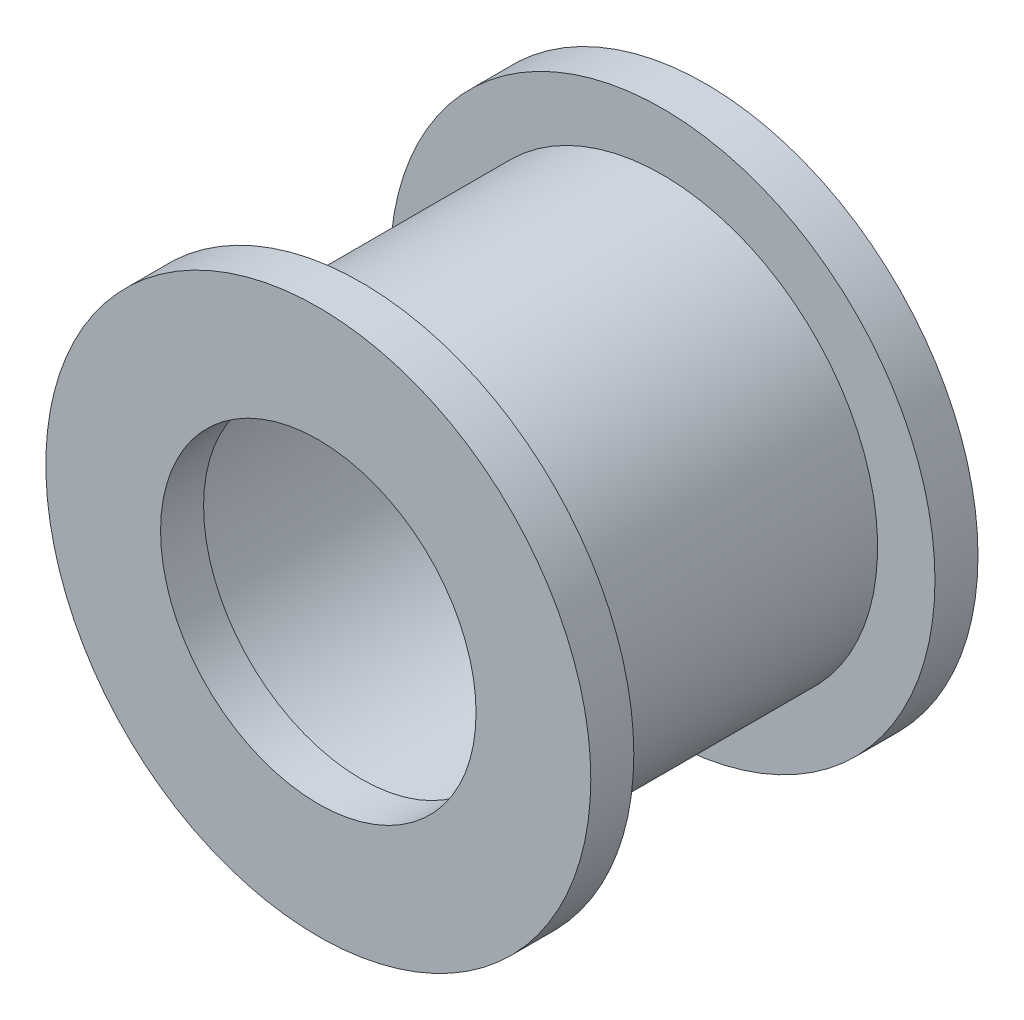
ISO-10303-21;
HEADER;
FILE_DESCRIPTION(('STEP AP214'),'2;1');
FILE_NAME('part.step','',(''),(''),'','','');
FILE_SCHEMA(('AUTOMOTIVE_DESIGN { 1 0 10303 214 1 1 1 1 }'));
ENDSEC;
DATA;
#1=APPLICATION_CONTEXT('core data for automotive mechanical design processes');
#2=APPLICATION_PROTOCOL_DEFINITION('international standard','automotive_design',2000,#1);
#3=PRODUCT_CONTEXT('',#1,'mechanical');
#4=PRODUCT('Part','Part','',(#3));
#5=PRODUCT_RELATED_PRODUCT_CATEGORY('part','',(#4));
#6=PRODUCT_DEFINITION_FORMATION('','',#4);
#7=PRODUCT_DEFINITION_CONTEXT('part definition',#1,'design');
#8=PRODUCT_DEFINITION('design','',#6,#7);
#9=PRODUCT_DEFINITION_SHAPE('','',#8);
#10=(LENGTH_UNIT() NAMED_UNIT(*) SI_UNIT(.MILLI.,.METRE.));
#11=(NAMED_UNIT(*) PLANE_ANGLE_UNIT() SI_UNIT($,.RADIAN.));
#12=(NAMED_UNIT(*) SI_UNIT($,.STERADIAN.) SOLID_ANGLE_UNIT());
#13=UNCERTAINTY_MEASURE_WITH_UNIT(LENGTH_MEASURE(1.E-05),#10,'distance_accuracy_value','');
#14=(GEOMETRIC_REPRESENTATION_CONTEXT(3) GLOBAL_UNCERTAINTY_ASSIGNED_CONTEXT((#13)) GLOBAL_UNIT_ASSIGNED_CONTEXT((#10,
#11,#12)) REPRESENTATION_CONTEXT('',''));
#15=CARTESIAN_POINT('',(0.,0.,0.));
#16=DIRECTION('',(0.,0.,1.));
#17=DIRECTION('',(1.,0.,0.));
#18=AXIS2_PLACEMENT_3D('',#15,#16,#17);
#19=CARTESIAN_POINT('',(0.,0.,1.5));
#20=DIRECTION('',(0.,0.,1.));
#21=DIRECTION('',(1.,0.,0.));
#22=AXIS2_PLACEMENT_3D('',#19,#20,#21);
#23=PLANE('',#22);
#24=CARTESIAN_POINT('',(0.,0.,1.5));
#25=DIRECTION('',(0.,0.,1.));
#26=DIRECTION('',(1.,0.,0.));
#27=AXIS2_PLACEMENT_3D('',#24,#25,#26);
#28=CIRCLE('',#27,5.5);
#29=CARTESIAN_POINT('',(5.5,0.,1.5));
#30=VERTEX_POINT('',#29);
#31=EDGE_CURVE('E47',#30,#30,#28,.T.);
#32=ORIENTED_EDGE('',*,*,#31,.F.);
#33=EDGE_LOOP('',(#32));
#34=FACE_BOUND('',#33,.T.);
#35=CARTESIAN_POINT('',(0.,0.,1.5));
#36=DIRECTION('',(0.,0.,1.));
#37=DIRECTION('',(1.,0.,0.));
#38=AXIS2_PLACEMENT_3D('',#35,#36,#37);
#39=CIRCLE('',#38,6.5);
#40=CARTESIAN_POINT('',(-6.5,0.,1.5));
#41=VERTEX_POINT('',#40);
#42=EDGE_CURVE('E10',#41,#41,#39,.F.);
#43=ORIENTED_EDGE('',*,*,#42,.F.);
#44=EDGE_LOOP('',(#43));
#45=FACE_BOUND('',#44,.T.);
#46=ADVANCED_FACE('F36',(#34,#45),#23,.T.);
#47=CARTESIAN_POINT('',(0.,0.,1.5));
#48=DIRECTION('',(0.,0.,-1.));
#49=DIRECTION('',(-1.,0.,0.));
#50=AXIS2_PLACEMENT_3D('',#47,#48,#49);
#51=CYLINDRICAL_SURFACE('',#50,5.5);
#52=ORIENTED_EDGE('',*,*,#31,.T.);
#53=EDGE_LOOP('',(#52));
#54=FACE_BOUND('',#53,.T.);
#55=CARTESIAN_POINT('',(0.,0.,0.));
#56=DIRECTION('',(0.,0.,1.));
#57=DIRECTION('',(1.,0.,0.));
#58=AXIS2_PLACEMENT_3D('',#55,#56,#57);
#59=CIRCLE('',#58,5.5);
#60=CARTESIAN_POINT('',(5.5,0.,0.));
#61=VERTEX_POINT('',#60);
#62=EDGE_CURVE('E56',#61,#61,#59,.T.);
#63=ORIENTED_EDGE('',*,*,#62,.F.);
#64=EDGE_LOOP('',(#63));
#65=FACE_BOUND('',#64,.T.);
#66=ADVANCED_FACE('F38',(#54,#65),#51,.F.);
#67=CARTESIAN_POINT('',(0.,0.,1.5));
#68=DIRECTION('',(0.,0.,-1.));
#69=DIRECTION('',(-1.,0.,0.));
#70=AXIS2_PLACEMENT_3D('',#67,#68,#69);
#71=CYLINDRICAL_SURFACE('',#70,9.49999999999999);
#72=CARTESIAN_POINT('',(0.,0.,1.5));
#73=DIRECTION('',(0.,0.,1.));
#74=DIRECTION('',(1.,0.,0.));
#75=AXIS2_PLACEMENT_3D('',#72,#73,#74);
#76=CIRCLE('',#75,9.49999999999999);
#77=CARTESIAN_POINT('',(9.49999999999999,0.,1.5));
#78=VERTEX_POINT('',#77);
#79=EDGE_CURVE('E43',#78,#78,#76,.T.);
#80=ORIENTED_EDGE('',*,*,#79,.F.);
#81=EDGE_LOOP('',(#80));
#82=FACE_BOUND('',#81,.T.);
#83=CARTESIAN_POINT('',(0.,0.,0.));
#84=DIRECTION('',(0.,0.,1.));
#85=DIRECTION('',(1.,0.,0.));
#86=AXIS2_PLACEMENT_3D('',#83,#84,#85);
#87=CIRCLE('',#86,9.49999999999999);
#88=CARTESIAN_POINT('',(9.49999999999999,0.,0.));
#89=VERTEX_POINT('',#88);
#90=EDGE_CURVE('E52',#89,#89,#87,.T.);
#91=ORIENTED_EDGE('',*,*,#90,.T.);
#92=EDGE_LOOP('',(#91));
#93=FACE_BOUND('',#92,.T.);
#94=ADVANCED_FACE('F62',(#82,#93),#71,.T.);
#95=CARTESIAN_POINT('',(0.,0.,1.5));
#96=DIRECTION('',(0.,0.,1.));
#97=DIRECTION('',(1.,0.,0.));
#98=AXIS2_PLACEMENT_3D('',#95,#96,#97);
#99=CIRCLE('',#98,7.5);
#100=CARTESIAN_POINT('',(-7.5,0.,1.5));
#101=VERTEX_POINT('',#100);
#102=EDGE_CURVE('E92',#101,#101,#99,.T.);
#103=ORIENTED_EDGE('',*,*,#102,.F.);
#104=EDGE_LOOP('',(#103));
#105=FACE_BOUND('',#104,.T.);
#106=ORIENTED_EDGE('',*,*,#79,.T.);
#107=EDGE_LOOP('',(#106));
#108=FACE_BOUND('',#107,.T.);
#109=ADVANCED_FACE('F68',(#105,#108),#23,.T.);
#110=CARTESIAN_POINT('',(0.,0.,0.));
#111=DIRECTION('',(0.,0.,1.));
#112=DIRECTION('',(1.,0.,0.));
#113=AXIS2_PLACEMENT_3D('',#110,#111,#112);
#114=PLANE('',#113);
#115=ORIENTED_EDGE('',*,*,#90,.F.);
#116=EDGE_LOOP('',(#115));
#117=FACE_BOUND('',#116,.T.);
#118=ORIENTED_EDGE('',*,*,#62,.T.);
#119=EDGE_LOOP('',(#118));
#120=FACE_BOUND('',#119,.T.);
#121=ADVANCED_FACE('F64',(#117,#120),#114,.F.);
#122=CARTESIAN_POINT('',(0.,0.,12.));
#123=DIRECTION('',(0.,0.,-1.));
#124=DIRECTION('',(-1.,0.,0.));
#125=AXIS2_PLACEMENT_3D('',#122,#123,#124);
#126=CYLINDRICAL_SURFACE('',#125,6.5);
#127=CARTESIAN_POINT('',(0.,0.,12.));
#128=DIRECTION('',(0.,0.,1.));
#129=DIRECTION('',(1.,0.,0.));
#130=AXIS2_PLACEMENT_3D('',#127,#128,#129);
#131=CIRCLE('',#130,6.5);
#132=CARTESIAN_POINT('',(-6.5,0.,12.));
#133=VERTEX_POINT('',#132);
#134=EDGE_CURVE('E94',#133,#133,#131,.T.);
#135=CARTESIAN_POINT('',(-6.5,0.,12.));
#136=CARTESIAN_POINT('',(-6.5,0.,11.890625));
#137=CARTESIAN_POINT('',(-6.5,0.,11.78125));
#138=CARTESIAN_POINT('',(-6.5,0.,11.5625));
#139=CARTESIAN_POINT('',(-6.5,0.,11.453125));
#140=CARTESIAN_POINT('',(-6.5,0.,11.234375));
#141=CARTESIAN_POINT('',(-6.5,0.,11.125));
#142=CARTESIAN_POINT('',(-6.5,0.,10.90625));
#143=CARTESIAN_POINT('',(-6.5,0.,10.796875));
#144=CARTESIAN_POINT('',(-6.5,0.,10.578125));
#145=CARTESIAN_POINT('',(-6.5,0.,10.46875));
#146=CARTESIAN_POINT('',(-6.5,0.,10.25));
#147=CARTESIAN_POINT('',(-6.5,0.,10.140625));
#148=CARTESIAN_POINT('',(-6.5,0.,9.921875));
#149=CARTESIAN_POINT('',(-6.5,0.,9.8125));
#150=CARTESIAN_POINT('',(-6.5,0.,9.59375));
#151=CARTESIAN_POINT('',(-6.5,0.,9.484375));
#152=CARTESIAN_POINT('',(-6.5,0.,9.265625));
#153=CARTESIAN_POINT('',(-6.5,0.,9.15625));
#154=CARTESIAN_POINT('',(-6.5,0.,8.9375));
#155=CARTESIAN_POINT('',(-6.5,0.,8.828125));
#156=CARTESIAN_POINT('',(-6.5,0.,8.609375));
#157=CARTESIAN_POINT('',(-6.5,0.,8.5));
#158=CARTESIAN_POINT('',(-6.5,0.,8.28125));
#159=CARTESIAN_POINT('',(-6.5,0.,8.171875));
#160=CARTESIAN_POINT('',(-6.5,0.,7.953125));
#161=CARTESIAN_POINT('',(-6.5,0.,7.84375));
#162=CARTESIAN_POINT('',(-6.5,0.,7.625));
#163=CARTESIAN_POINT('',(-6.5,0.,7.515625));
#164=CARTESIAN_POINT('',(-6.5,0.,7.296875));
#165=CARTESIAN_POINT('',(-6.5,0.,7.1875));
#166=CARTESIAN_POINT('',(-6.5,0.,6.96875));
#167=CARTESIAN_POINT('',(-6.5,0.,6.859375));
#168=CARTESIAN_POINT('',(-6.5,0.,6.640625));
#169=CARTESIAN_POINT('',(-6.5,0.,6.53125));
#170=CARTESIAN_POINT('',(-6.5,0.,6.3125));
#171=CARTESIAN_POINT('',(-6.5,0.,6.203125));
#172=CARTESIAN_POINT('',(-6.5,0.,5.984375));
#173=CARTESIAN_POINT('',(-6.5,0.,5.875));
#174=CARTESIAN_POINT('',(-6.5,0.,5.65625));
#175=CARTESIAN_POINT('',(-6.5,0.,5.546875));
#176=CARTESIAN_POINT('',(-6.5,0.,5.328125));
#177=CARTESIAN_POINT('',(-6.5,0.,5.21875));
#178=CARTESIAN_POINT('',(-6.5,0.,5.));
#179=CARTESIAN_POINT('',(-6.5,0.,4.890625));
#180=CARTESIAN_POINT('',(-6.5,0.,4.671875));
#181=CARTESIAN_POINT('',(-6.5,0.,4.5625));
#182=CARTESIAN_POINT('',(-6.5,0.,4.34375));
#183=CARTESIAN_POINT('',(-6.5,0.,4.234375));
#184=CARTESIAN_POINT('',(-6.5,0.,4.015625));
#185=CARTESIAN_POINT('',(-6.5,0.,3.90625));
#186=CARTESIAN_POINT('',(-6.5,0.,3.6875));
#187=CARTESIAN_POINT('',(-6.5,0.,3.578125));
#188=CARTESIAN_POINT('',(-6.5,0.,3.359375));
#189=CARTESIAN_POINT('',(-6.5,0.,3.25));
#190=CARTESIAN_POINT('',(-6.5,0.,3.03125));
#191=CARTESIAN_POINT('',(-6.5,0.,2.921875));
#192=CARTESIAN_POINT('',(-6.5,0.,2.703125));
#193=CARTESIAN_POINT('',(-6.5,0.,2.59375));
#194=CARTESIAN_POINT('',(-6.5,0.,2.375));
#195=CARTESIAN_POINT('',(-6.5,0.,2.265625));
#196=CARTESIAN_POINT('',(-6.5,0.,2.046875));
#197=CARTESIAN_POINT('',(-6.5,0.,1.9375));
#198=CARTESIAN_POINT('',(-6.5,0.,1.71875));
#199=CARTESIAN_POINT('',(-6.5,0.,1.609375));
#200=CARTESIAN_POINT('',(-6.5,0.,1.5));
#201=B_SPLINE_CURVE_WITH_KNOTS('',3,(#135,#136,#137,#138,#139,#140,#141,#142,#143,#144,#145,
#146,#147,#148,#149,#150,#151,#152,#153,#154,#155,#156,#157,#158,#159,#160,#161,#162,#163,#164,
#165,#166,#167,#168,#169,#170,#171,#172,#173,#174,#175,#176,#177,#178,#179,#180,#181,#182,#183,
#184,#185,#186,#187,#188,#189,#190,#191,#192,#193,#194,#195,#196,#197,#198,#199,#200),
.UNSPECIFIED.,.F.,.F.,(4,2,2,2,2,2,2,2,2,2,2,2,2,2,2,2,2,2,2,2,2,2,2,2,2,2,2,2,2,2,2,2,4),(0.,
0.328125,0.656250000000001,0.984375000000001,1.3125,1.640625,1.96875,2.296875,2.625,2.953125,
3.28125,3.609375,3.9375,4.265625,4.59375,4.921875,5.25,5.578125,5.90625,6.234375,6.5625,
6.890625,7.21875,7.546875,7.875,8.203125,8.53125,8.859375,9.1875,9.515625,9.84375,10.171875,
10.5),.UNSPECIFIED.);
#202=EDGE_CURVE('BSEAM67',#133,#41,#201,.T.);
#203=ORIENTED_EDGE('',*,*,#134,.T.);
#204=ORIENTED_EDGE('',*,*,#42,.T.);
#205=ORIENTED_EDGE('',*,*,#202,.T.);
#206=ORIENTED_EDGE('',*,*,#202,.F.);
#207=EDGE_LOOP('',(#203,#205,#204,#206));
#208=FACE_BOUND('',#207,.T.);
#209=ADVANCED_FACE('F67',(#208),#126,.F.);
#210=CARTESIAN_POINT('',(0.,0.,12.));
#211=DIRECTION('',(0.,0.,-1.));
#212=DIRECTION('',(-1.,0.,0.));
#213=AXIS2_PLACEMENT_3D('',#210,#211,#212);
#214=CYLINDRICAL_SURFACE('',#213,7.5);
#215=CARTESIAN_POINT('',(0.,0.,12.));
#216=DIRECTION('',(0.,0.,1.));
#217=DIRECTION('',(1.,0.,0.));
#218=AXIS2_PLACEMENT_3D('',#215,#216,#217);
#219=CIRCLE('',#218,7.5);
#220=CARTESIAN_POINT('',(-7.5,0.,12.));
#221=VERTEX_POINT('',#220);
#222=EDGE_CURVE('E58',#221,#221,#219,.T.);
#223=CARTESIAN_POINT('',(-7.5,0.,12.));
#224=CARTESIAN_POINT('',(-7.5,0.,11.890625));
#225=CARTESIAN_POINT('',(-7.5,0.,11.78125));
#226=CARTESIAN_POINT('',(-7.5,0.,11.5625));
#227=CARTESIAN_POINT('',(-7.5,0.,11.453125));
#228=CARTESIAN_POINT('',(-7.5,0.,11.234375));
#229=CARTESIAN_POINT('',(-7.5,0.,11.125));
#230=CARTESIAN_POINT('',(-7.5,0.,10.90625));
#231=CARTESIAN_POINT('',(-7.5,0.,10.796875));
#232=CARTESIAN_POINT('',(-7.5,0.,10.578125));
#233=CARTESIAN_POINT('',(-7.5,0.,10.46875));
#234=CARTESIAN_POINT('',(-7.5,0.,10.25));
#235=CARTESIAN_POINT('',(-7.5,0.,10.140625));
#236=CARTESIAN_POINT('',(-7.5,0.,9.921875));
#237=CARTESIAN_POINT('',(-7.5,0.,9.8125));
#238=CARTESIAN_POINT('',(-7.5,0.,9.59375));
#239=CARTESIAN_POINT('',(-7.5,0.,9.484375));
#240=CARTESIAN_POINT('',(-7.5,0.,9.265625));
#241=CARTESIAN_POINT('',(-7.5,0.,9.15625));
#242=CARTESIAN_POINT('',(-7.5,0.,8.9375));
#243=CARTESIAN_POINT('',(-7.5,0.,8.828125));
#244=CARTESIAN_POINT('',(-7.5,0.,8.609375));
#245=CARTESIAN_POINT('',(-7.5,0.,8.5));
#246=CARTESIAN_POINT('',(-7.5,0.,8.28125));
#247=CARTESIAN_POINT('',(-7.5,0.,8.171875));
#248=CARTESIAN_POINT('',(-7.5,0.,7.953125));
#249=CARTESIAN_POINT('',(-7.5,0.,7.84375));
#250=CARTESIAN_POINT('',(-7.5,0.,7.625));
#251=CARTESIAN_POINT('',(-7.5,0.,7.515625));
#252=CARTESIAN_POINT('',(-7.5,0.,7.296875));
#253=CARTESIAN_POINT('',(-7.5,0.,7.1875));
#254=CARTESIAN_POINT('',(-7.5,0.,6.96875));
#255=CARTESIAN_POINT('',(-7.5,0.,6.859375));
#256=CARTESIAN_POINT('',(-7.5,0.,6.640625));
#257=CARTESIAN_POINT('',(-7.5,0.,6.53125));
#258=CARTESIAN_POINT('',(-7.5,0.,6.3125));
#259=CARTESIAN_POINT('',(-7.5,0.,6.203125));
#260=CARTESIAN_POINT('',(-7.5,0.,5.984375));
#261=CARTESIAN_POINT('',(-7.5,0.,5.875));
#262=CARTESIAN_POINT('',(-7.5,0.,5.65625));
#263=CARTESIAN_POINT('',(-7.5,0.,5.546875));
#264=CARTESIAN_POINT('',(-7.5,0.,5.328125));
#265=CARTESIAN_POINT('',(-7.5,0.,5.21875));
#266=CARTESIAN_POINT('',(-7.5,0.,5.));
#267=CARTESIAN_POINT('',(-7.5,0.,4.890625));
#268=CARTESIAN_POINT('',(-7.5,0.,4.671875));
#269=CARTESIAN_POINT('',(-7.5,0.,4.5625));
#270=CARTESIAN_POINT('',(-7.5,0.,4.34375));
#271=CARTESIAN_POINT('',(-7.5,0.,4.234375));
#272=CARTESIAN_POINT('',(-7.5,0.,4.015625));
#273=CARTESIAN_POINT('',(-7.5,0.,3.90625));
#274=CARTESIAN_POINT('',(-7.5,0.,3.6875));
#275=CARTESIAN_POINT('',(-7.5,0.,3.578125));
#276=CARTESIAN_POINT('',(-7.5,0.,3.359375));
#277=CARTESIAN_POINT('',(-7.5,0.,3.25));
#278=CARTESIAN_POINT('',(-7.5,0.,3.03125));
#279=CARTESIAN_POINT('',(-7.5,0.,2.921875));
#280=CARTESIAN_POINT('',(-7.5,0.,2.703125));
#281=CARTESIAN_POINT('',(-7.5,0.,2.59375));
#282=CARTESIAN_POINT('',(-7.5,0.,2.375));
#283=CARTESIAN_POINT('',(-7.5,0.,2.265625));
#284=CARTESIAN_POINT('',(-7.5,0.,2.046875));
#285=CARTESIAN_POINT('',(-7.5,0.,1.9375));
#286=CARTESIAN_POINT('',(-7.5,0.,1.71875));
#287=CARTESIAN_POINT('',(-7.5,0.,1.609375));
#288=CARTESIAN_POINT('',(-7.5,0.,1.5));
#289=B_SPLINE_CURVE_WITH_KNOTS('',3,(#223,#224,#225,#226,#227,#228,#229,#230,#231,#232,#233,
#234,#235,#236,#237,#238,#239,#240,#241,#242,#243,#244,#245,#246,#247,#248,#249,#250,#251,#252,
#253,#254,#255,#256,#257,#258,#259,#260,#261,#262,#263,#264,#265,#266,#267,#268,#269,#270,#271,
#272,#273,#274,#275,#276,#277,#278,#279,#280,#281,#282,#283,#284,#285,#286,#287,#288),
.UNSPECIFIED.,.F.,.F.,(4,2,2,2,2,2,2,2,2,2,2,2,2,2,2,2,2,2,2,2,2,2,2,2,2,2,2,2,2,2,2,2,4),(0.,
0.328125,0.656250000000001,0.984375000000001,1.3125,1.640625,1.96875,2.296875,2.625,2.953125,
3.28125,3.609375,3.9375,4.265625,4.59375,4.921875,5.25,5.578125,5.90625,6.234375,6.5625,
6.890625,7.21875,7.546875,7.875,8.203125,8.53125,8.859375,9.1875,9.515625,9.84375,10.171875,
10.5),.UNSPECIFIED.);
#290=EDGE_CURVE('BSEAM136',#221,#101,#289,.T.);
#291=ORIENTED_EDGE('',*,*,#222,.F.);
#292=ORIENTED_EDGE('',*,*,#102,.T.);
#293=ORIENTED_EDGE('',*,*,#290,.T.);
#294=ORIENTED_EDGE('',*,*,#290,.F.);
#295=EDGE_LOOP('',(#291,#293,#292,#294));
#296=FACE_BOUND('',#295,.T.);
#297=ADVANCED_FACE('F136',(#296),#214,.T.);
#298=CARTESIAN_POINT('',(0.,0.,12.));
#299=DIRECTION('',(0.,0.,1.));
#300=DIRECTION('',(1.,0.,0.));
#301=AXIS2_PLACEMENT_3D('',#298,#299,#300);
#302=PLANE('',#301);
#303=CARTESIAN_POINT('',(0.,0.,12.));
#304=DIRECTION('',(0.,0.,1.));
#305=DIRECTION('',(1.,0.,0.));
#306=AXIS2_PLACEMENT_3D('',#303,#304,#305);
#307=CIRCLE('',#306,5.5);
#308=CARTESIAN_POINT('',(5.5,0.,12.));
#309=VERTEX_POINT('',#308);
#310=EDGE_CURVE('E105',#309,#309,#307,.T.);
#311=ORIENTED_EDGE('',*,*,#310,.T.);
#312=EDGE_LOOP('',(#311));
#313=FACE_BOUND('',#312,.T.);
#314=ORIENTED_EDGE('',*,*,#134,.F.);
#315=EDGE_LOOP('',(#314));
#316=FACE_BOUND('',#315,.T.);
#317=ADVANCED_FACE('F132',(#313,#316),#302,.F.);
#318=CARTESIAN_POINT('',(0.,0.,13.5));
#319=DIRECTION('',(0.,0.,-1.));
#320=DIRECTION('',(-1.,0.,0.));
#321=AXIS2_PLACEMENT_3D('',#318,#319,#320);
#322=CYLINDRICAL_SURFACE('',#321,5.5);
#323=CARTESIAN_POINT('',(0.,0.,13.5));
#324=DIRECTION('',(0.,0.,1.));
#325=DIRECTION('',(1.,0.,0.));
#326=AXIS2_PLACEMENT_3D('',#323,#324,#325);
#327=CIRCLE('',#326,5.5);
#328=CARTESIAN_POINT('',(5.5,0.,13.5));
#329=VERTEX_POINT('',#328);
#330=EDGE_CURVE('E104',#329,#329,#327,.T.);
#331=ORIENTED_EDGE('',*,*,#330,.T.);
#332=EDGE_LOOP('',(#331));
#333=FACE_BOUND('',#332,.T.);
#334=ORIENTED_EDGE('',*,*,#310,.F.);
#335=EDGE_LOOP('',(#334));
#336=FACE_BOUND('',#335,.T.);
#337=ADVANCED_FACE('F113',(#333,#336),#322,.F.);
#338=CARTESIAN_POINT('',(0.,0.,13.5));
#339=DIRECTION('',(0.,0.,-1.));
#340=DIRECTION('',(-1.,0.,0.));
#341=AXIS2_PLACEMENT_3D('',#338,#339,#340);
#342=CYLINDRICAL_SURFACE('',#341,9.49999999999999);
#343=CARTESIAN_POINT('',(0.,0.,13.5));
#344=DIRECTION('',(0.,0.,1.));
#345=DIRECTION('',(1.,0.,0.));
#346=AXIS2_PLACEMENT_3D('',#343,#344,#345);
#347=CIRCLE('',#346,9.49999999999999);
#348=CARTESIAN_POINT('',(9.49999999999999,0.,13.5));
#349=VERTEX_POINT('',#348);
#350=EDGE_CURVE('E98',#349,#349,#347,.T.);
#351=ORIENTED_EDGE('',*,*,#350,.F.);
#352=EDGE_LOOP('',(#351));
#353=FACE_BOUND('',#352,.T.);
#354=CARTESIAN_POINT('',(0.,0.,12.));
#355=DIRECTION('',(0.,0.,1.));
#356=DIRECTION('',(1.,0.,0.));
#357=AXIS2_PLACEMENT_3D('',#354,#355,#356);
#358=CIRCLE('',#357,9.49999999999999);
#359=CARTESIAN_POINT('',(9.49999999999999,0.,12.));
#360=VERTEX_POINT('',#359);
#361=EDGE_CURVE('E101',#360,#360,#358,.T.);
#362=ORIENTED_EDGE('',*,*,#361,.T.);
#363=EDGE_LOOP('',(#362));
#364=FACE_BOUND('',#363,.T.);
#365=ADVANCED_FACE('F120',(#353,#364),#342,.T.);
#366=CARTESIAN_POINT('',(0.,0.,13.5));
#367=DIRECTION('',(0.,0.,1.));
#368=DIRECTION('',(1.,0.,0.));
#369=AXIS2_PLACEMENT_3D('',#366,#367,#368);
#370=PLANE('',#369);
#371=ORIENTED_EDGE('',*,*,#330,.F.);
#372=EDGE_LOOP('',(#371));
#373=FACE_BOUND('',#372,.T.);
#374=ORIENTED_EDGE('',*,*,#350,.T.);
#375=EDGE_LOOP('',(#374));
#376=FACE_BOUND('',#375,.T.);
#377=ADVANCED_FACE('F116',(#373,#376),#370,.T.);
#378=ORIENTED_EDGE('',*,*,#222,.T.);
#379=EDGE_LOOP('',(#378));
#380=FACE_BOUND('',#379,.T.);
#381=ORIENTED_EDGE('',*,*,#361,.F.);
#382=EDGE_LOOP('',(#381));
#383=FACE_BOUND('',#382,.T.);
#384=ADVANCED_FACE('F119',(#380,#383),#302,.F.);
#385=CLOSED_SHELL('',(#46,#66,#94,#109,#121,#209,#297,#317,#337,#365,#377,#384));
#386=MANIFOLD_SOLID_BREP('B2',#385);
#387=ADVANCED_BREP_SHAPE_REPRESENTATION('',(#18,#386),#14);
#388=SHAPE_DEFINITION_REPRESENTATION(#9,#387);
ENDSEC;
END-ISO-10303-21;
